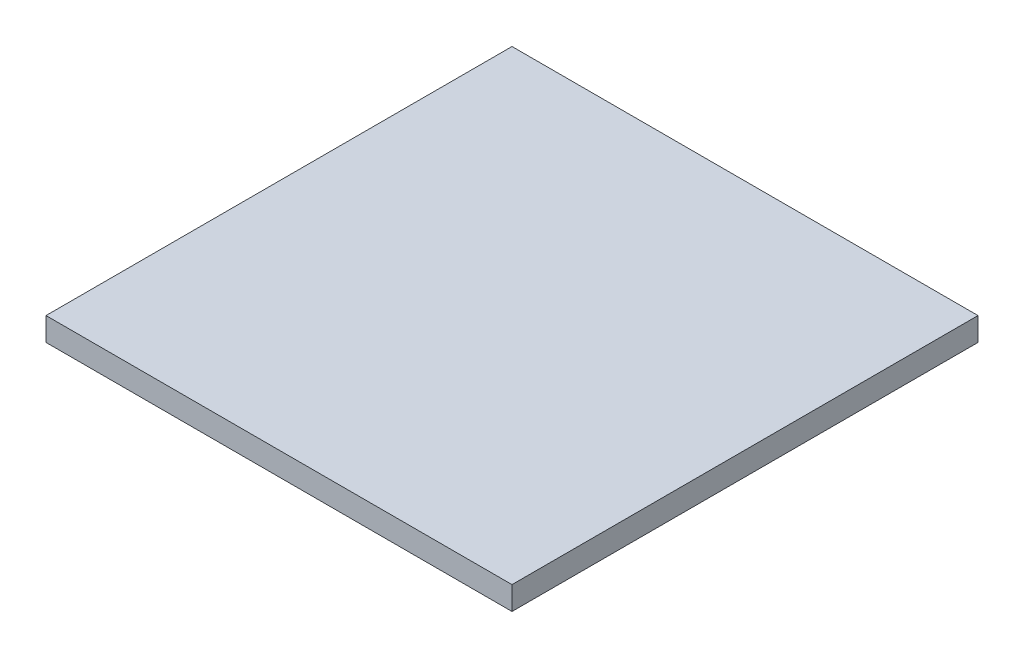
ISO-10303-21;
HEADER;
FILE_DESCRIPTION(('STEP AP214'),'2;1');
FILE_NAME('part.step','',(''),(''),'','','');
FILE_SCHEMA(('AUTOMOTIVE_DESIGN { 1 0 10303 214 1 1 1 1 }'));
ENDSEC;
DATA;
#1=APPLICATION_CONTEXT('core data for automotive mechanical design processes');
#2=APPLICATION_PROTOCOL_DEFINITION('international standard','automotive_design',2000,#1);
#3=PRODUCT_CONTEXT('',#1,'mechanical');
#4=PRODUCT('Part','Part','',(#3));
#5=PRODUCT_RELATED_PRODUCT_CATEGORY('part','',(#4));
#6=PRODUCT_DEFINITION_FORMATION('','',#4);
#7=PRODUCT_DEFINITION_CONTEXT('part definition',#1,'design');
#8=PRODUCT_DEFINITION('design','',#6,#7);
#9=PRODUCT_DEFINITION_SHAPE('','',#8);
#10=(LENGTH_UNIT() NAMED_UNIT(*) SI_UNIT(.MILLI.,.METRE.));
#11=(NAMED_UNIT(*) PLANE_ANGLE_UNIT() SI_UNIT($,.RADIAN.));
#12=(NAMED_UNIT(*) SI_UNIT($,.STERADIAN.) SOLID_ANGLE_UNIT());
#13=UNCERTAINTY_MEASURE_WITH_UNIT(LENGTH_MEASURE(1.E-05),#10,'distance_accuracy_value','');
#14=(GEOMETRIC_REPRESENTATION_CONTEXT(3) GLOBAL_UNCERTAINTY_ASSIGNED_CONTEXT((#13)) GLOBAL_UNIT_ASSIGNED_CONTEXT((#10,
#11,#12)) REPRESENTATION_CONTEXT('',''));
#15=CARTESIAN_POINT('',(0.,0.,0.));
#16=DIRECTION('',(0.,0.,1.));
#17=DIRECTION('',(1.,0.,0.));
#18=AXIS2_PLACEMENT_3D('',#15,#16,#17);
#19=CARTESIAN_POINT('',(0.,5.,0.));
#20=CARTESIAN_POINT('',(0.,1.66666666666667,0.));
#21=CARTESIAN_POINT('',(0.,-1.66666666666667,0.));
#22=CARTESIAN_POINT('',(0.,-5.,0.));
#23=CARTESIAN_POINT('',(-66.6666666666667,5.,0.));
#24=CARTESIAN_POINT('',(-66.6666666666667,1.66666666666667,0.));
#25=CARTESIAN_POINT('',(-66.6666666666667,-1.66666666666667,0.));
#26=CARTESIAN_POINT('',(-66.6666666666667,-5.,0.));
#27=CARTESIAN_POINT('',(-133.333333333333,5.,0.));
#28=CARTESIAN_POINT('',(-133.333333333333,1.66666666666667,0.));
#29=CARTESIAN_POINT('',(-133.333333333333,-1.66666666666667,0.));
#30=CARTESIAN_POINT('',(-133.333333333333,-5.,0.));
#31=CARTESIAN_POINT('',(-200.,5.,0.));
#32=CARTESIAN_POINT('',(-200.,1.66666666666667,0.));
#33=CARTESIAN_POINT('',(-200.,-1.66666666666667,0.));
#34=CARTESIAN_POINT('',(-200.,-5.,0.));
#35=B_SPLINE_SURFACE_WITH_KNOTS('',3,3,((#19,#20,#21,#22),(#23,#24,#25,#26),(#27,#28,#29,#30),
(#31,#32,#33,#34)),.UNSPECIFIED.,.F.,.F.,.F.,(4,4),(4,4),(0.,1.),(0.,1.),.UNSPECIFIED.);
#36=CARTESIAN_POINT('',(0.,5.,0.));
#37=CARTESIAN_POINT('',(-66.6666666666667,5.,0.));
#38=CARTESIAN_POINT('',(-133.333333333333,5.,0.));
#39=CARTESIAN_POINT('',(-200.,5.,0.));
#40=B_SPLINE_CURVE_WITH_KNOTS('',3,(#36,#37,#38,#39),.UNSPECIFIED.,.F.,.F.,(4,4),(0.,1.),.UNSPECIFIED.);
#41=CARTESIAN_POINT('',(0.,5.,0.));
#42=VERTEX_POINT('',#41);
#43=CARTESIAN_POINT('',(-200.,5.,0.));
#44=VERTEX_POINT('',#43);
#45=EDGE_CURVE('E14',#42,#44,#40,.T.);
#46=CARTESIAN_POINT('',(-200.,5.,0.));
#47=CARTESIAN_POINT('',(-200.,1.66666666666667,0.));
#48=CARTESIAN_POINT('',(-200.,-1.66666666666667,0.));
#49=CARTESIAN_POINT('',(-200.,-5.,0.));
#50=B_SPLINE_CURVE_WITH_KNOTS('',3,(#46,#47,#48,#49),.UNSPECIFIED.,.F.,.F.,(4,4),(0.,1.),.UNSPECIFIED.);
#51=CARTESIAN_POINT('',(-200.,-5.,0.));
#52=VERTEX_POINT('',#51);
#53=EDGE_CURVE('E78',#44,#52,#50,.T.);
#54=CARTESIAN_POINT('',(0.,-5.,0.));
#55=CARTESIAN_POINT('',(-66.6666666666667,-5.,0.));
#56=CARTESIAN_POINT('',(-133.333333333333,-5.,0.));
#57=CARTESIAN_POINT('',(-200.,-5.,0.));
#58=B_SPLINE_CURVE_WITH_KNOTS('',3,(#54,#55,#56,#57),.UNSPECIFIED.,.F.,.F.,(4,4),(0.,1.),.UNSPECIFIED.);
#59=CARTESIAN_POINT('',(0.,-5.,0.));
#60=VERTEX_POINT('',#59);
#61=EDGE_CURVE('E86',#52,#60,#58,.F.);
#62=CARTESIAN_POINT('',(0.,5.,0.));
#63=CARTESIAN_POINT('',(0.,1.66666666666667,0.));
#64=CARTESIAN_POINT('',(0.,-1.66666666666667,0.));
#65=CARTESIAN_POINT('',(0.,-5.,0.));
#66=B_SPLINE_CURVE_WITH_KNOTS('',3,(#62,#63,#64,#65),.UNSPECIFIED.,.F.,.F.,(4,4),(0.,1.),.UNSPECIFIED.);
#67=EDGE_CURVE('E70',#60,#42,#66,.F.);
#68=ORIENTED_EDGE('',*,*,#45,.T.);
#69=ORIENTED_EDGE('',*,*,#53,.T.);
#70=ORIENTED_EDGE('',*,*,#61,.T.);
#71=ORIENTED_EDGE('',*,*,#67,.T.);
#72=EDGE_LOOP('',(#68,#69,#70,#71));
#73=FACE_BOUND('',#72,.T.);
#74=ADVANCED_FACE('F67',(#73),#35,.T.);
#75=OPEN_SHELL('',(#74));
#76=SHELL_BASED_SURFACE_MODEL('B2',(#75));
#77=CARTESIAN_POINT('',(-200.,5.,100.));
#78=DIRECTION('',(1.,0.,0.));
#79=DIRECTION('',(0.,0.,-1.));
#80=AXIS2_PLACEMENT_3D('',#77,#78,#79);
#81=PLANE('',#80);
#82=DIRECTION('',(0.,-1.,0.));
#83=VECTOR('',#82,1.);
#84=CARTESIAN_POINT('',(-200.,5.,-100.));
#85=LINE('',#84,#83);
#86=CARTESIAN_POINT('',(-200.,5.,-100.));
#87=VERTEX_POINT('',#86);
#88=CARTESIAN_POINT('',(-200.,-5.,-100.));
#89=VERTEX_POINT('',#88);
#90=EDGE_CURVE('E201',#87,#89,#85,.T.);
#91=ORIENTED_EDGE('',*,*,#90,.T.);
#92=DIRECTION('',(0.,0.,-1.));
#93=VECTOR('',#92,1.);
#94=CARTESIAN_POINT('',(-200.,-5.,100.));
#95=LINE('',#94,#93);
#96=CARTESIAN_POINT('',(-200.,-5.,100.));
#97=VERTEX_POINT('',#96);
#98=EDGE_CURVE('E65',#97,#89,#95,.T.);
#99=ORIENTED_EDGE('',*,*,#98,.F.);
#100=DIRECTION('',(0.,-1.,0.));
#101=VECTOR('',#100,1.);
#102=CARTESIAN_POINT('',(-200.,5.,100.));
#103=LINE('',#102,#101);
#104=CARTESIAN_POINT('',(-200.,5.,100.));
#105=VERTEX_POINT('',#104);
#106=EDGE_CURVE('E189',#105,#97,#103,.T.);
#107=ORIENTED_EDGE('',*,*,#106,.F.);
#108=DIRECTION('',(0.,0.,-1.));
#109=VECTOR('',#108,1.);
#110=CARTESIAN_POINT('',(-200.,5.,100.));
#111=LINE('',#110,#109);
#112=EDGE_CURVE('E197',#105,#87,#111,.T.);
#113=ORIENTED_EDGE('',*,*,#112,.T.);
#114=EDGE_LOOP('',(#91,#99,#107,#113));
#115=FACE_BOUND('',#114,.T.);
#116=ADVANCED_FACE('F138',(#115),#81,.F.);
#117=CARTESIAN_POINT('',(-200.,-5.,100.));
#118=DIRECTION('',(0.,1.,0.));
#119=DIRECTION('',(0.,0.,1.));
#120=AXIS2_PLACEMENT_3D('',#117,#118,#119);
#121=PLANE('',#120);
#122=DIRECTION('',(1.,0.,0.));
#123=VECTOR('',#122,1.);
#124=CARTESIAN_POINT('',(-200.,-5.,-100.));
#125=LINE('',#124,#123);
#126=CARTESIAN_POINT('',(0.,-5.,-100.));
#127=VERTEX_POINT('',#126);
#128=EDGE_CURVE('E193',#89,#127,#125,.T.);
#129=ORIENTED_EDGE('',*,*,#128,.T.);
#130=DIRECTION('',(0.,0.,-1.));
#131=VECTOR('',#130,1.);
#132=CARTESIAN_POINT('',(0.,-5.,100.));
#133=LINE('',#132,#131);
#134=CARTESIAN_POINT('',(0.,-5.,100.));
#135=VERTEX_POINT('',#134);
#136=EDGE_CURVE('E146',#135,#127,#133,.T.);
#137=ORIENTED_EDGE('',*,*,#136,.F.);
#138=DIRECTION('',(1.,0.,0.));
#139=VECTOR('',#138,1.);
#140=CARTESIAN_POINT('',(-200.,-5.,100.));
#141=LINE('',#140,#139);
#142=EDGE_CURVE('E184',#97,#135,#141,.T.);
#143=ORIENTED_EDGE('',*,*,#142,.F.);
#144=ORIENTED_EDGE('',*,*,#98,.T.);
#145=EDGE_LOOP('',(#129,#137,#143,#144));
#146=FACE_BOUND('',#145,.T.);
#147=ADVANCED_FACE('F192',(#146),#121,.F.);
#148=CARTESIAN_POINT('',(0.,5.,100.));
#149=DIRECTION('',(-1.,0.,0.));
#150=DIRECTION('',(0.,0.,1.));
#151=AXIS2_PLACEMENT_3D('',#148,#149,#150);
#152=PLANE('',#151);
#153=DIRECTION('',(0.,1.,0.));
#154=VECTOR('',#153,1.);
#155=CARTESIAN_POINT('',(0.,5.,-100.));
#156=LINE('',#155,#154);
#157=CARTESIAN_POINT('',(0.,5.,-100.));
#158=VERTEX_POINT('',#157);
#159=EDGE_CURVE('E171',#127,#158,#156,.T.);
#160=ORIENTED_EDGE('',*,*,#159,.T.);
#161=DIRECTION('',(0.,0.,-1.));
#162=VECTOR('',#161,1.);
#163=CARTESIAN_POINT('',(0.,5.,100.));
#164=LINE('',#163,#162);
#165=CARTESIAN_POINT('',(0.,5.,100.));
#166=VERTEX_POINT('',#165);
#167=EDGE_CURVE('E194',#166,#158,#164,.T.);
#168=ORIENTED_EDGE('',*,*,#167,.F.);
#169=DIRECTION('',(0.,1.,0.));
#170=VECTOR('',#169,1.);
#171=CARTESIAN_POINT('',(0.,5.,100.));
#172=LINE('',#171,#170);
#173=EDGE_CURVE('E187',#135,#166,#172,.T.);
#174=ORIENTED_EDGE('',*,*,#173,.F.);
#175=ORIENTED_EDGE('',*,*,#136,.T.);
#176=EDGE_LOOP('',(#160,#168,#174,#175));
#177=FACE_BOUND('',#176,.T.);
#178=ADVANCED_FACE('F195',(#177),#152,.F.);
#179=CARTESIAN_POINT('',(-200.,5.,100.));
#180=DIRECTION('',(0.,-1.,0.));
#181=DIRECTION('',(0.,0.,-1.));
#182=AXIS2_PLACEMENT_3D('',#179,#180,#181);
#183=PLANE('',#182);
#184=DIRECTION('',(-1.,0.,0.));
#185=VECTOR('',#184,1.);
#186=CARTESIAN_POINT('',(-200.,5.,-100.));
#187=LINE('',#186,#185);
#188=EDGE_CURVE('E177',#158,#87,#187,.T.);
#189=ORIENTED_EDGE('',*,*,#188,.T.);
#190=ORIENTED_EDGE('',*,*,#112,.F.);
#191=DIRECTION('',(-1.,0.,0.));
#192=VECTOR('',#191,1.);
#193=CARTESIAN_POINT('',(-200.,5.,100.));
#194=LINE('',#193,#192);
#195=EDGE_CURVE('E154',#166,#105,#194,.T.);
#196=ORIENTED_EDGE('',*,*,#195,.F.);
#197=ORIENTED_EDGE('',*,*,#167,.T.);
#198=EDGE_LOOP('',(#189,#190,#196,#197));
#199=FACE_BOUND('',#198,.T.);
#200=ADVANCED_FACE('F208',(#199),#183,.F.);
#201=CARTESIAN_POINT('',(0.,0.,100.));
#202=DIRECTION('',(0.,0.,1.));
#203=DIRECTION('',(1.,0.,0.));
#204=AXIS2_PLACEMENT_3D('',#201,#202,#203);
#205=PLANE('',#204);
#206=ORIENTED_EDGE('',*,*,#106,.T.);
#207=ORIENTED_EDGE('',*,*,#142,.T.);
#208=ORIENTED_EDGE('',*,*,#173,.T.);
#209=ORIENTED_EDGE('',*,*,#195,.T.);
#210=EDGE_LOOP('',(#206,#207,#208,#209));
#211=FACE_BOUND('',#210,.T.);
#212=ADVANCED_FACE('F185',(#211),#205,.T.);
#213=CARTESIAN_POINT('',(0.,0.,-100.));
#214=DIRECTION('',(0.,0.,1.));
#215=DIRECTION('',(1.,0.,0.));
#216=AXIS2_PLACEMENT_3D('',#213,#214,#215);
#217=PLANE('',#216);
#218=ORIENTED_EDGE('',*,*,#90,.F.);
#219=ORIENTED_EDGE('',*,*,#188,.F.);
#220=ORIENTED_EDGE('',*,*,#159,.F.);
#221=ORIENTED_EDGE('',*,*,#128,.F.);
#222=EDGE_LOOP('',(#218,#219,#220,#221));
#223=FACE_BOUND('',#222,.T.);
#224=ADVANCED_FACE('F211',(#223),#217,.F.);
#225=CLOSED_SHELL('',(#116,#147,#178,#200,#212,#224));
#226=MANIFOLD_SOLID_BREP('B8',#225);
#227=ADVANCED_BREP_SHAPE_REPRESENTATION('',(#18,#226),#14);
#228=MANIFOLD_SURFACE_SHAPE_REPRESENTATION('',(#18,#76),#14);
#229=SHAPE_REPRESENTATION('',(#18),#14);
#230=SHAPE_DEFINITION_REPRESENTATION(#9,#229);
#231=SHAPE_REPRESENTATION_RELATIONSHIP('','',#229,#227);
#232=SHAPE_REPRESENTATION_RELATIONSHIP('','',#229,#228);
ENDSEC;
END-ISO-10303-21;
